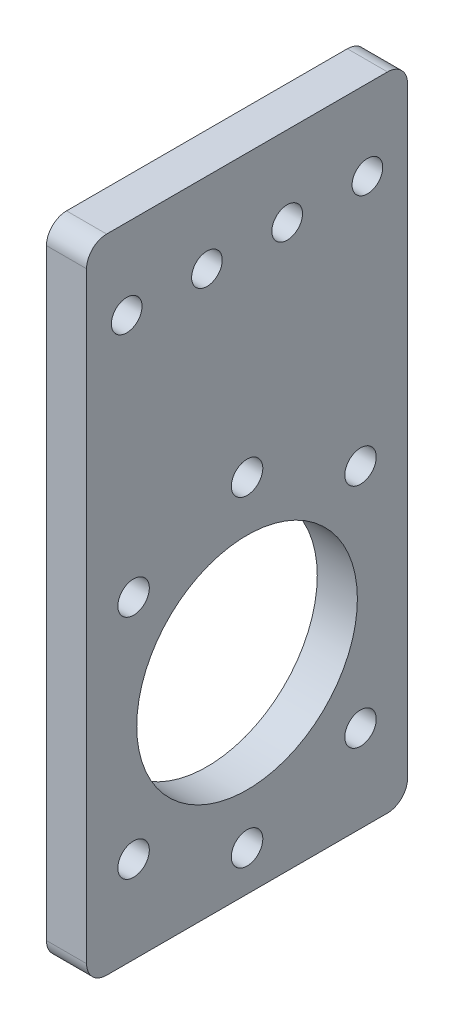
ISO-10303-21;
HEADER;
FILE_DESCRIPTION(('STEP AP214'),'2;1');
FILE_NAME('part.step','',(''),(''),'','','');
FILE_SCHEMA(('AUTOMOTIVE_DESIGN { 1 0 10303 214 1 1 1 1 }'));
ENDSEC;
DATA;
#1=APPLICATION_CONTEXT('core data for automotive mechanical design processes');
#2=APPLICATION_PROTOCOL_DEFINITION('international standard','automotive_design',2000,#1);
#3=PRODUCT_CONTEXT('',#1,'mechanical');
#4=PRODUCT('Part','Part','',(#3));
#5=PRODUCT_RELATED_PRODUCT_CATEGORY('part','',(#4));
#6=PRODUCT_DEFINITION_FORMATION('','',#4);
#7=PRODUCT_DEFINITION_CONTEXT('part definition',#1,'design');
#8=PRODUCT_DEFINITION('design','',#6,#7);
#9=PRODUCT_DEFINITION_SHAPE('','',#8);
#10=(LENGTH_UNIT() NAMED_UNIT(*) SI_UNIT(.MILLI.,.METRE.));
#11=(NAMED_UNIT(*) PLANE_ANGLE_UNIT() SI_UNIT($,.RADIAN.));
#12=(NAMED_UNIT(*) SI_UNIT($,.STERADIAN.) SOLID_ANGLE_UNIT());
#13=UNCERTAINTY_MEASURE_WITH_UNIT(LENGTH_MEASURE(1.E-05),#10,'distance_accuracy_value','');
#14=(GEOMETRIC_REPRESENTATION_CONTEXT(3) GLOBAL_UNCERTAINTY_ASSIGNED_CONTEXT((#13)) GLOBAL_UNIT_ASSIGNED_CONTEXT((#10,
#11,#12)) REPRESENTATION_CONTEXT('',''));
#15=CARTESIAN_POINT('',(0.,0.,0.));
#16=DIRECTION('',(0.,0.,1.));
#17=DIRECTION('',(1.,0.,0.));
#18=AXIS2_PLACEMENT_3D('',#15,#16,#17);
#19=CARTESIAN_POINT('',(-285.75,-85.725,82.55));
#20=DIRECTION('',(0.,0.,1.));
#21=DIRECTION('',(1.,0.,0.));
#22=AXIS2_PLACEMENT_3D('',#19,#20,#21);
#23=PLANE('',#22);
#24=DIRECTION('',(0.,-1.,0.));
#25=VECTOR('',#24,1.);
#26=CARTESIAN_POINT('',(-285.75,-85.725,82.55));
#27=LINE('',#26,#25);
#28=CARTESIAN_POINT('',(-285.75,-3.175,82.55));
#29=VERTEX_POINT('',#28);
#30=CARTESIAN_POINT('',(-285.75,-98.425,82.55));
#31=VERTEX_POINT('',#30);
#32=EDGE_CURVE('E170',#29,#31,#27,.T.);
#33=ORIENTED_EDGE('',*,*,#32,.T.);
#34=DIRECTION('',(1.,0.,0.));
#35=VECTOR('',#34,1.);
#36=CARTESIAN_POINT('',(-279.4,-98.425,82.55));
#37=LINE('',#36,#35);
#38=CARTESIAN_POINT('',(-279.4,-98.425,82.55));
#39=VERTEX_POINT('',#38);
#40=EDGE_CURVE('E154',#31,#39,#37,.T.);
#41=ORIENTED_EDGE('',*,*,#40,.T.);
#42=DIRECTION('',(0.,-1.,0.));
#43=VECTOR('',#42,1.);
#44=CARTESIAN_POINT('',(-279.4,-85.725,82.55));
#45=LINE('',#44,#43);
#46=CARTESIAN_POINT('',(-279.4,-3.175,82.55));
#47=VERTEX_POINT('',#46);
#48=EDGE_CURVE('E109',#47,#39,#45,.T.);
#49=ORIENTED_EDGE('',*,*,#48,.F.);
#50=DIRECTION('',(1.,0.,0.));
#51=VECTOR('',#50,1.);
#52=CARTESIAN_POINT('',(-285.75,-3.175,82.55));
#53=LINE('',#52,#51);
#54=EDGE_CURVE('E152',#47,#29,#53,.F.);
#55=ORIENTED_EDGE('',*,*,#54,.T.);
#56=EDGE_LOOP('',(#33,#41,#49,#55));
#57=FACE_BOUND('',#56,.T.);
#58=ADVANCED_FACE('F17',(#57),#23,.T.);
#59=CARTESIAN_POINT('',(-285.75,0.,622.3));
#60=DIRECTION('',(0.,1.,0.));
#61=DIRECTION('',(0.,0.,1.));
#62=AXIS2_PLACEMENT_3D('',#59,#60,#61);
#63=PLANE('',#62);
#64=DIRECTION('',(0.,0.,1.));
#65=VECTOR('',#64,1.);
#66=CARTESIAN_POINT('',(-279.4,0.,622.3));
#67=LINE('',#66,#65);
#68=CARTESIAN_POINT('',(-279.4,0.,34.925));
#69=VERTEX_POINT('',#68);
#70=CARTESIAN_POINT('',(-279.4,0.,79.375));
#71=VERTEX_POINT('',#70);
#72=EDGE_CURVE('E132',#69,#71,#67,.T.);
#73=ORIENTED_EDGE('',*,*,#72,.F.);
#74=DIRECTION('',(1.,0.,0.));
#75=VECTOR('',#74,1.);
#76=CARTESIAN_POINT('',(-285.75,0.,34.925));
#77=LINE('',#76,#75);
#78=CARTESIAN_POINT('',(-285.75,0.,34.925));
#79=VERTEX_POINT('',#78);
#80=EDGE_CURVE('E11',#69,#79,#77,.F.);
#81=ORIENTED_EDGE('',*,*,#80,.T.);
#82=DIRECTION('',(0.,0.,1.));
#83=VECTOR('',#82,1.);
#84=CARTESIAN_POINT('',(-285.75,0.,622.3));
#85=LINE('',#84,#83);
#86=CARTESIAN_POINT('',(-285.75,0.,79.375));
#87=VERTEX_POINT('',#86);
#88=EDGE_CURVE('E136',#79,#87,#85,.T.);
#89=ORIENTED_EDGE('',*,*,#88,.T.);
#90=DIRECTION('',(1.,0.,0.));
#91=VECTOR('',#90,1.);
#92=CARTESIAN_POINT('',(-285.75,0.,79.375));
#93=LINE('',#92,#91);
#94=EDGE_CURVE('E25',#87,#71,#93,.T.);
#95=ORIENTED_EDGE('',*,*,#94,.T.);
#96=EDGE_LOOP('',(#73,#81,#89,#95));
#97=FACE_BOUND('',#96,.T.);
#98=ADVANCED_FACE('F158',(#97),#63,.T.);
#99=CARTESIAN_POINT('',(-285.75,-85.725,31.75));
#100=DIRECTION('',(0.,0.,1.));
#101=DIRECTION('',(1.,0.,0.));
#102=AXIS2_PLACEMENT_3D('',#99,#100,#101);
#103=PLANE('',#102);
#104=DIRECTION('',(0.,-1.,0.));
#105=VECTOR('',#104,1.);
#106=CARTESIAN_POINT('',(-279.4,-85.725,31.75));
#107=LINE('',#106,#105);
#108=CARTESIAN_POINT('',(-279.4,-3.175,31.75));
#109=VERTEX_POINT('',#108);
#110=CARTESIAN_POINT('',(-279.4,-98.425,31.75));
#111=VERTEX_POINT('',#110);
#112=EDGE_CURVE('E110',#109,#111,#107,.T.);
#113=ORIENTED_EDGE('',*,*,#112,.T.);
#114=DIRECTION('',(1.,0.,0.));
#115=VECTOR('',#114,1.);
#116=CARTESIAN_POINT('',(-285.75,-98.425,31.75));
#117=LINE('',#116,#115);
#118=CARTESIAN_POINT('',(-285.75,-98.425,31.75));
#119=VERTEX_POINT('',#118);
#120=EDGE_CURVE('E87',#111,#119,#117,.F.);
#121=ORIENTED_EDGE('',*,*,#120,.T.);
#122=DIRECTION('',(0.,-1.,0.));
#123=VECTOR('',#122,1.);
#124=CARTESIAN_POINT('',(-285.75,-85.725,31.75));
#125=LINE('',#124,#123);
#126=CARTESIAN_POINT('',(-285.75,-3.175,31.75));
#127=VERTEX_POINT('',#126);
#128=EDGE_CURVE('E135',#127,#119,#125,.T.);
#129=ORIENTED_EDGE('',*,*,#128,.F.);
#130=DIRECTION('',(1.,0.,0.));
#131=VECTOR('',#130,1.);
#132=CARTESIAN_POINT('',(-279.4,-3.175,31.75));
#133=LINE('',#132,#131);
#134=EDGE_CURVE('E92',#127,#109,#133,.T.);
#135=ORIENTED_EDGE('',*,*,#134,.T.);
#136=EDGE_LOOP('',(#113,#121,#129,#135));
#137=FACE_BOUND('',#136,.T.);
#138=ADVANCED_FACE('F167',(#137),#103,.F.);
#139=CARTESIAN_POINT('',(-285.75,-12.7,63.5));
#140=DIRECTION('',(1.,0.,0.));
#141=DIRECTION('',(0.,0.,-1.));
#142=AXIS2_PLACEMENT_3D('',#139,#140,#141);
#143=CYLINDRICAL_SURFACE('',#142,2.4257);
#144=CARTESIAN_POINT('',(-285.75,-12.7,63.5));
#145=DIRECTION('',(-1.,0.,0.));
#146=DIRECTION('',(0.,0.,1.));
#147=AXIS2_PLACEMENT_3D('',#144,#145,#146);
#148=CIRCLE('',#147,2.4257);
#149=CARTESIAN_POINT('',(-285.75,-12.7,65.9257));
#150=VERTEX_POINT('',#149);
#151=EDGE_CURVE('E186',#150,#150,#148,.T.);
#152=ORIENTED_EDGE('',*,*,#151,.T.);
#153=EDGE_LOOP('',(#152));
#154=FACE_BOUND('',#153,.T.);
#155=CARTESIAN_POINT('',(-279.4,-12.7,63.5));
#156=DIRECTION('',(-1.,0.,0.));
#157=DIRECTION('',(0.,0.,1.));
#158=AXIS2_PLACEMENT_3D('',#155,#156,#157);
#159=CIRCLE('',#158,2.4257);
#160=CARTESIAN_POINT('',(-279.4,-12.7,65.9257));
#161=VERTEX_POINT('',#160);
#162=EDGE_CURVE('E126',#161,#161,#159,.T.);
#163=ORIENTED_EDGE('',*,*,#162,.F.);
#164=EDGE_LOOP('',(#163));
#165=FACE_BOUND('',#164,.T.);
#166=ADVANCED_FACE('F227',(#154,#165),#143,.F.);
#167=CARTESIAN_POINT('',(-285.75,-12.7,76.2));
#168=DIRECTION('',(1.,0.,0.));
#169=DIRECTION('',(0.,0.,-1.));
#170=AXIS2_PLACEMENT_3D('',#167,#168,#169);
#171=CYLINDRICAL_SURFACE('',#170,2.4257);
#172=CARTESIAN_POINT('',(-285.75,-12.7,76.2));
#173=DIRECTION('',(-1.,0.,0.));
#174=DIRECTION('',(0.,0.,1.));
#175=AXIS2_PLACEMENT_3D('',#172,#173,#174);
#176=CIRCLE('',#175,2.4257);
#177=CARTESIAN_POINT('',(-285.75,-12.7,78.6257));
#178=VERTEX_POINT('',#177);
#179=EDGE_CURVE('E183',#178,#178,#176,.T.);
#180=ORIENTED_EDGE('',*,*,#179,.T.);
#181=EDGE_LOOP('',(#180));
#182=FACE_BOUND('',#181,.T.);
#183=CARTESIAN_POINT('',(-279.4,-12.7,76.2));
#184=DIRECTION('',(-1.,0.,0.));
#185=DIRECTION('',(0.,0.,1.));
#186=AXIS2_PLACEMENT_3D('',#183,#184,#185);
#187=CIRCLE('',#186,2.4257);
#188=CARTESIAN_POINT('',(-279.4,-12.7,78.6257));
#189=VERTEX_POINT('',#188);
#190=EDGE_CURVE('E123',#189,#189,#187,.T.);
#191=ORIENTED_EDGE('',*,*,#190,.F.);
#192=EDGE_LOOP('',(#191));
#193=FACE_BOUND('',#192,.T.);
#194=ADVANCED_FACE('F254',(#182,#193),#171,.F.);
#195=CARTESIAN_POINT('',(-285.75,-12.7,38.1));
#196=DIRECTION('',(1.,0.,0.));
#197=DIRECTION('',(0.,0.,-1.));
#198=AXIS2_PLACEMENT_3D('',#195,#196,#197);
#199=CYLINDRICAL_SURFACE('',#198,2.4257);
#200=CARTESIAN_POINT('',(-285.75,-12.7,38.1));
#201=DIRECTION('',(-1.,0.,0.));
#202=DIRECTION('',(0.,0.,1.));
#203=AXIS2_PLACEMENT_3D('',#200,#201,#202);
#204=CIRCLE('',#203,2.4257);
#205=CARTESIAN_POINT('',(-285.75,-12.7,40.5257));
#206=VERTEX_POINT('',#205);
#207=EDGE_CURVE('E180',#206,#206,#204,.T.);
#208=ORIENTED_EDGE('',*,*,#207,.T.);
#209=EDGE_LOOP('',(#208));
#210=FACE_BOUND('',#209,.T.);
#211=CARTESIAN_POINT('',(-279.4,-12.7,38.1));
#212=DIRECTION('',(-1.,0.,0.));
#213=DIRECTION('',(0.,0.,1.));
#214=AXIS2_PLACEMENT_3D('',#211,#212,#213);
#215=CIRCLE('',#214,2.4257);
#216=CARTESIAN_POINT('',(-279.4,-12.7,40.5257));
#217=VERTEX_POINT('',#216);
#218=EDGE_CURVE('E120',#217,#217,#215,.T.);
#219=ORIENTED_EDGE('',*,*,#218,.F.);
#220=EDGE_LOOP('',(#219));
#221=FACE_BOUND('',#220,.T.);
#222=ADVANCED_FACE('F263',(#210,#221),#199,.F.);
#223=CARTESIAN_POINT('',(-285.75,-69.85,57.15));
#224=DIRECTION('',(1.,0.,0.));
#225=DIRECTION('',(0.,0.,-1.));
#226=AXIS2_PLACEMENT_3D('',#223,#224,#225);
#227=CYLINDRICAL_SURFACE('',#226,17.4625);
#228=CARTESIAN_POINT('',(-285.75,-69.85,57.15));
#229=DIRECTION('',(-1.,0.,0.));
#230=DIRECTION('',(0.,0.,1.));
#231=AXIS2_PLACEMENT_3D('',#228,#229,#230);
#232=CIRCLE('',#231,17.4625);
#233=CARTESIAN_POINT('',(-285.75,-69.85,74.6125));
#234=VERTEX_POINT('',#233);
#235=EDGE_CURVE('E177',#234,#234,#232,.T.);
#236=ORIENTED_EDGE('',*,*,#235,.T.);
#237=EDGE_LOOP('',(#236));
#238=FACE_BOUND('',#237,.T.);
#239=CARTESIAN_POINT('',(-279.4,-69.85,57.15));
#240=DIRECTION('',(-1.,0.,0.));
#241=DIRECTION('',(0.,0.,1.));
#242=AXIS2_PLACEMENT_3D('',#239,#240,#241);
#243=CIRCLE('',#242,17.4625);
#244=CARTESIAN_POINT('',(-279.4,-69.85,74.6125));
#245=VERTEX_POINT('',#244);
#246=EDGE_CURVE('E112',#245,#245,#243,.T.);
#247=ORIENTED_EDGE('',*,*,#246,.F.);
#248=EDGE_LOOP('',(#247));
#249=FACE_BOUND('',#248,.T.);
#250=ADVANCED_FACE('F221',(#238,#249),#227,.F.);
#251=CARTESIAN_POINT('',(-285.75,-101.6,57.15));
#252=DIRECTION('',(0.,1.,0.));
#253=DIRECTION('',(0.,0.,1.));
#254=AXIS2_PLACEMENT_3D('',#251,#252,#253);
#255=PLANE('',#254);
#256=DIRECTION('',(0.,0.,1.));
#257=VECTOR('',#256,1.);
#258=CARTESIAN_POINT('',(-285.75,-101.6,57.15));
#259=LINE('',#258,#257);
#260=CARTESIAN_POINT('',(-285.75,-101.6,34.925));
#261=VERTEX_POINT('',#260);
#262=CARTESIAN_POINT('',(-285.75,-101.6,79.375));
#263=VERTEX_POINT('',#262);
#264=EDGE_CURVE('E102',#261,#263,#259,.T.);
#265=ORIENTED_EDGE('',*,*,#264,.F.);
#266=DIRECTION('',(1.,0.,0.));
#267=VECTOR('',#266,1.);
#268=CARTESIAN_POINT('',(-285.75,-101.6,34.925));
#269=LINE('',#268,#267);
#270=CARTESIAN_POINT('',(-279.4,-101.6,34.925));
#271=VERTEX_POINT('',#270);
#272=EDGE_CURVE('E86',#261,#271,#269,.T.);
#273=ORIENTED_EDGE('',*,*,#272,.T.);
#274=DIRECTION('',(0.,0.,1.));
#275=VECTOR('',#274,1.);
#276=CARTESIAN_POINT('',(-279.4,-101.6,57.15));
#277=LINE('',#276,#275);
#278=CARTESIAN_POINT('',(-279.4,-101.6,79.375));
#279=VERTEX_POINT('',#278);
#280=EDGE_CURVE('E99',#271,#279,#277,.T.);
#281=ORIENTED_EDGE('',*,*,#280,.T.);
#282=DIRECTION('',(1.,0.,0.));
#283=VECTOR('',#282,1.);
#284=CARTESIAN_POINT('',(-285.75,-101.6,79.375));
#285=LINE('',#284,#283);
#286=EDGE_CURVE('E104',#279,#263,#285,.F.);
#287=ORIENTED_EDGE('',*,*,#286,.T.);
#288=EDGE_LOOP('',(#265,#273,#281,#287));
#289=FACE_BOUND('',#288,.T.);
#290=ADVANCED_FACE('F98',(#289),#255,.F.);
#291=CARTESIAN_POINT('',(-285.75,-12.7,50.8));
#292=DIRECTION('',(1.,0.,0.));
#293=DIRECTION('',(0.,0.,-1.));
#294=AXIS2_PLACEMENT_3D('',#291,#292,#293);
#295=CYLINDRICAL_SURFACE('',#294,2.4257);
#296=CARTESIAN_POINT('',(-285.75,-12.7,50.8));
#297=DIRECTION('',(-1.,0.,0.));
#298=DIRECTION('',(0.,0.,1.));
#299=AXIS2_PLACEMENT_3D('',#296,#297,#298);
#300=CIRCLE('',#299,2.4257);
#301=CARTESIAN_POINT('',(-285.75,-12.7,53.2257));
#302=VERTEX_POINT('',#301);
#303=EDGE_CURVE('E189',#302,#302,#300,.T.);
#304=ORIENTED_EDGE('',*,*,#303,.T.);
#305=EDGE_LOOP('',(#304));
#306=FACE_BOUND('',#305,.T.);
#307=CARTESIAN_POINT('',(-279.4,-12.7,50.8));
#308=DIRECTION('',(-1.,0.,0.));
#309=DIRECTION('',(0.,0.,1.));
#310=AXIS2_PLACEMENT_3D('',#307,#308,#309);
#311=CIRCLE('',#310,2.4257);
#312=CARTESIAN_POINT('',(-279.4,-12.7,53.2257));
#313=VERTEX_POINT('',#312);
#314=EDGE_CURVE('E129',#313,#313,#311,.T.);
#315=ORIENTED_EDGE('',*,*,#314,.F.);
#316=EDGE_LOOP('',(#315));
#317=FACE_BOUND('',#316,.T.);
#318=ADVANCED_FACE('F193',(#306,#317),#295,.F.);
#319=CARTESIAN_POINT('',(-285.75,-50.8,622.3));
#320=DIRECTION('',(-1.,0.,0.));
#321=DIRECTION('',(0.,-1.,0.));
#322=AXIS2_PLACEMENT_3D('',#319,#320,#321);
#323=PLANE('',#322);
#324=CARTESIAN_POINT('',(-285.75,-87.8105122421383,75.1105122421384));
#325=DIRECTION('',(-1.,0.,0.));
#326=DIRECTION('',(0.,0.,1.));
#327=AXIS2_PLACEMENT_3D('',#324,#325,#326);
#328=CIRCLE('',#327,2.4892);
#329=CARTESIAN_POINT('',(-285.75,-87.8105122421383,77.5997122421384));
#330=VERTEX_POINT('',#329);
#331=EDGE_CURVE('E114',#330,#330,#328,.F.);
#332=ORIENTED_EDGE('',*,*,#331,.T.);
#333=EDGE_LOOP('',(#332));
#334=FACE_BOUND('',#333,.T.);
#335=CARTESIAN_POINT('',(-285.75,-95.25,57.15));
#336=DIRECTION('',(-1.,0.,0.));
#337=DIRECTION('',(0.,0.,1.));
#338=AXIS2_PLACEMENT_3D('',#335,#336,#337);
#339=CIRCLE('',#338,2.4892);
#340=CARTESIAN_POINT('',(-285.75,-95.25,59.6392));
#341=VERTEX_POINT('',#340);
#342=EDGE_CURVE('E393',#341,#341,#339,.F.);
#343=ORIENTED_EDGE('',*,*,#342,.T.);
#344=EDGE_LOOP('',(#343));
#345=FACE_BOUND('',#344,.T.);
#346=CARTESIAN_POINT('',(-285.75,-87.8105122421383,39.1894877578618));
#347=DIRECTION('',(-1.,0.,0.));
#348=DIRECTION('',(0.,0.,1.));
#349=AXIS2_PLACEMENT_3D('',#346,#347,#348);
#350=CIRCLE('',#349,2.4892);
#351=CARTESIAN_POINT('',(-285.75,-87.8105122421383,41.6786877578618));
#352=VERTEX_POINT('',#351);
#353=EDGE_CURVE('E391',#352,#352,#350,.F.);
#354=ORIENTED_EDGE('',*,*,#353,.T.);
#355=EDGE_LOOP('',(#354));
#356=FACE_BOUND('',#355,.T.);
#357=CARTESIAN_POINT('',(-285.75,-44.45,57.15));
#358=DIRECTION('',(-1.,0.,0.));
#359=DIRECTION('',(0.,0.,1.));
#360=AXIS2_PLACEMENT_3D('',#357,#358,#359);
#361=CIRCLE('',#360,2.4892);
#362=CARTESIAN_POINT('',(-285.75,-44.45,59.6392));
#363=VERTEX_POINT('',#362);
#364=EDGE_CURVE('E388',#363,#363,#361,.F.);
#365=ORIENTED_EDGE('',*,*,#364,.T.);
#366=EDGE_LOOP('',(#365));
#367=FACE_BOUND('',#366,.T.);
#368=CARTESIAN_POINT('',(-285.75,-51.8894877578617,39.1894877578618));
#369=DIRECTION('',(-1.,0.,0.));
#370=DIRECTION('',(0.,0.,1.));
#371=AXIS2_PLACEMENT_3D('',#368,#369,#370);
#372=CIRCLE('',#371,2.4892);
#373=CARTESIAN_POINT('',(-285.75,-51.8894877578617,41.6786877578618));
#374=VERTEX_POINT('',#373);
#375=EDGE_CURVE('E385',#374,#374,#372,.F.);
#376=ORIENTED_EDGE('',*,*,#375,.T.);
#377=EDGE_LOOP('',(#376));
#378=FACE_BOUND('',#377,.T.);
#379=CARTESIAN_POINT('',(-285.75,-51.8894877578617,75.1105122421384));
#380=DIRECTION('',(-1.,0.,0.));
#381=DIRECTION('',(0.,0.,1.));
#382=AXIS2_PLACEMENT_3D('',#379,#380,#381);
#383=CIRCLE('',#382,2.4892);
#384=CARTESIAN_POINT('',(-285.75,-51.8894877578617,77.5997122421384));
#385=VERTEX_POINT('',#384);
#386=EDGE_CURVE('E382',#385,#385,#383,.F.);
#387=ORIENTED_EDGE('',*,*,#386,.T.);
#388=EDGE_LOOP('',(#387));
#389=FACE_BOUND('',#388,.T.);
#390=ORIENTED_EDGE('',*,*,#128,.T.);
#391=CARTESIAN_POINT('',(-285.75,-98.425,34.925));
#392=DIRECTION('',(-1.,0.,0.));
#393=DIRECTION('',(0.,0.,1.));
#394=AXIS2_PLACEMENT_3D('',#391,#392,#393);
#395=CIRCLE('',#394,3.175);
#396=EDGE_CURVE('E150',#119,#261,#395,.T.);
#397=ORIENTED_EDGE('',*,*,#396,.T.);
#398=ORIENTED_EDGE('',*,*,#264,.T.);
#399=CARTESIAN_POINT('',(-285.75,-98.425,79.375));
#400=DIRECTION('',(-1.,0.,0.));
#401=DIRECTION('',(0.,0.,1.));
#402=AXIS2_PLACEMENT_3D('',#399,#400,#401);
#403=CIRCLE('',#402,3.175);
#404=EDGE_CURVE('E148',#263,#31,#403,.T.);
#405=ORIENTED_EDGE('',*,*,#404,.T.);
#406=ORIENTED_EDGE('',*,*,#32,.F.);
#407=CARTESIAN_POINT('',(-285.75,-3.175,79.375));
#408=DIRECTION('',(-1.,0.,0.));
#409=DIRECTION('',(0.,0.,1.));
#410=AXIS2_PLACEMENT_3D('',#407,#408,#409);
#411=CIRCLE('',#410,3.175);
#412=EDGE_CURVE('E32',#29,#87,#411,.T.);
#413=ORIENTED_EDGE('',*,*,#412,.T.);
#414=ORIENTED_EDGE('',*,*,#88,.F.);
#415=CARTESIAN_POINT('',(-285.75,-3.175,34.925));
#416=DIRECTION('',(-1.,0.,0.));
#417=DIRECTION('',(0.,0.,1.));
#418=AXIS2_PLACEMENT_3D('',#415,#416,#417);
#419=CIRCLE('',#418,3.175);
#420=EDGE_CURVE('E146',#79,#127,#419,.T.);
#421=ORIENTED_EDGE('',*,*,#420,.T.);
#422=EDGE_LOOP('',(#390,#397,#398,#405,#406,#413,#414,#421));
#423=FACE_BOUND('',#422,.T.);
#424=ORIENTED_EDGE('',*,*,#235,.F.);
#425=EDGE_LOOP('',(#424));
#426=FACE_BOUND('',#425,.T.);
#427=ORIENTED_EDGE('',*,*,#207,.F.);
#428=EDGE_LOOP('',(#427));
#429=FACE_BOUND('',#428,.T.);
#430=ORIENTED_EDGE('',*,*,#179,.F.);
#431=EDGE_LOOP('',(#430));
#432=FACE_BOUND('',#431,.T.);
#433=ORIENTED_EDGE('',*,*,#151,.F.);
#434=EDGE_LOOP('',(#433));
#435=FACE_BOUND('',#434,.T.);
#436=ORIENTED_EDGE('',*,*,#303,.F.);
#437=EDGE_LOOP('',(#436));
#438=FACE_BOUND('',#437,.T.);
#439=ADVANCED_FACE('F196',(#334,#345,#356,#367,#378,#389,#423,#426,#429,#432,#435,#438),#323,.T.);
#440=CARTESIAN_POINT('',(-279.4,-50.8,622.3));
#441=DIRECTION('',(-1.,0.,0.));
#442=DIRECTION('',(0.,-1.,0.));
#443=AXIS2_PLACEMENT_3D('',#440,#441,#442);
#444=PLANE('',#443);
#445=CARTESIAN_POINT('',(-279.4,-87.8105122421383,75.1105122421384));
#446=DIRECTION('',(-1.,0.,0.));
#447=DIRECTION('',(0.,0.,1.));
#448=AXIS2_PLACEMENT_3D('',#445,#446,#447);
#449=CIRCLE('',#448,2.4892);
#450=CARTESIAN_POINT('',(-279.4,-87.8105122421383,77.5997122421384));
#451=VERTEX_POINT('',#450);
#452=EDGE_CURVE('E364',#451,#451,#449,.T.);
#453=ORIENTED_EDGE('',*,*,#452,.T.);
#454=EDGE_LOOP('',(#453));
#455=FACE_BOUND('',#454,.T.);
#456=CARTESIAN_POINT('',(-279.4,-95.25,57.15));
#457=DIRECTION('',(-1.,0.,0.));
#458=DIRECTION('',(0.,0.,1.));
#459=AXIS2_PLACEMENT_3D('',#456,#457,#458);
#460=CIRCLE('',#459,2.4892);
#461=CARTESIAN_POINT('',(-279.4,-95.25,59.6392));
#462=VERTEX_POINT('',#461);
#463=EDGE_CURVE('E365',#462,#462,#460,.T.);
#464=ORIENTED_EDGE('',*,*,#463,.T.);
#465=EDGE_LOOP('',(#464));
#466=FACE_BOUND('',#465,.T.);
#467=CARTESIAN_POINT('',(-279.4,-87.8105122421383,39.1894877578618));
#468=DIRECTION('',(-1.,0.,0.));
#469=DIRECTION('',(0.,0.,1.));
#470=AXIS2_PLACEMENT_3D('',#467,#468,#469);
#471=CIRCLE('',#470,2.4892);
#472=CARTESIAN_POINT('',(-279.4,-87.8105122421383,41.6786877578618));
#473=VERTEX_POINT('',#472);
#474=EDGE_CURVE('E369',#473,#473,#471,.T.);
#475=ORIENTED_EDGE('',*,*,#474,.T.);
#476=EDGE_LOOP('',(#475));
#477=FACE_BOUND('',#476,.T.);
#478=CARTESIAN_POINT('',(-279.4,-44.45,57.15));
#479=DIRECTION('',(-1.,0.,0.));
#480=DIRECTION('',(0.,0.,1.));
#481=AXIS2_PLACEMENT_3D('',#478,#479,#480);
#482=CIRCLE('',#481,2.4892);
#483=CARTESIAN_POINT('',(-279.4,-44.45,59.6392));
#484=VERTEX_POINT('',#483);
#485=EDGE_CURVE('E374',#484,#484,#482,.T.);
#486=ORIENTED_EDGE('',*,*,#485,.T.);
#487=EDGE_LOOP('',(#486));
#488=FACE_BOUND('',#487,.T.);
#489=CARTESIAN_POINT('',(-279.4,-51.8894877578617,39.1894877578618));
#490=DIRECTION('',(-1.,0.,0.));
#491=DIRECTION('',(0.,0.,1.));
#492=AXIS2_PLACEMENT_3D('',#489,#490,#491);
#493=CIRCLE('',#492,2.4892);
#494=CARTESIAN_POINT('',(-279.4,-51.8894877578617,41.6786877578618));
#495=VERTEX_POINT('',#494);
#496=EDGE_CURVE('E366',#495,#495,#493,.T.);
#497=ORIENTED_EDGE('',*,*,#496,.T.);
#498=EDGE_LOOP('',(#497));
#499=FACE_BOUND('',#498,.T.);
#500=CARTESIAN_POINT('',(-279.4,-51.8894877578617,75.1105122421384));
#501=DIRECTION('',(-1.,0.,0.));
#502=DIRECTION('',(0.,0.,1.));
#503=AXIS2_PLACEMENT_3D('',#500,#501,#502);
#504=CIRCLE('',#503,2.4892);
#505=CARTESIAN_POINT('',(-279.4,-51.8894877578617,77.5997122421384));
#506=VERTEX_POINT('',#505);
#507=EDGE_CURVE('E377',#506,#506,#504,.T.);
#508=ORIENTED_EDGE('',*,*,#507,.T.);
#509=EDGE_LOOP('',(#508));
#510=FACE_BOUND('',#509,.T.);
#511=ORIENTED_EDGE('',*,*,#280,.F.);
#512=CARTESIAN_POINT('',(-279.4,-98.425,34.925));
#513=DIRECTION('',(-1.,0.,0.));
#514=DIRECTION('',(0.,0.,1.));
#515=AXIS2_PLACEMENT_3D('',#512,#513,#514);
#516=CIRCLE('',#515,3.175);
#517=EDGE_CURVE('E82',#271,#111,#516,.F.);
#518=ORIENTED_EDGE('',*,*,#517,.T.);
#519=ORIENTED_EDGE('',*,*,#112,.F.);
#520=CARTESIAN_POINT('',(-279.4,-3.175,34.925));
#521=DIRECTION('',(-1.,0.,0.));
#522=DIRECTION('',(0.,0.,1.));
#523=AXIS2_PLACEMENT_3D('',#520,#521,#522);
#524=CIRCLE('',#523,3.175);
#525=EDGE_CURVE('E139',#109,#69,#524,.F.);
#526=ORIENTED_EDGE('',*,*,#525,.T.);
#527=ORIENTED_EDGE('',*,*,#72,.T.);
#528=CARTESIAN_POINT('',(-279.4,-3.175,79.375));
#529=DIRECTION('',(-1.,0.,0.));
#530=DIRECTION('',(0.,0.,1.));
#531=AXIS2_PLACEMENT_3D('',#528,#529,#530);
#532=CIRCLE('',#531,3.175);
#533=EDGE_CURVE('E103',#71,#47,#532,.F.);
#534=ORIENTED_EDGE('',*,*,#533,.T.);
#535=ORIENTED_EDGE('',*,*,#48,.T.);
#536=CARTESIAN_POINT('',(-279.4,-98.425,79.375));
#537=DIRECTION('',(-1.,0.,0.));
#538=DIRECTION('',(0.,0.,1.));
#539=AXIS2_PLACEMENT_3D('',#536,#537,#538);
#540=CIRCLE('',#539,3.175);
#541=EDGE_CURVE('E93',#39,#279,#540,.F.);
#542=ORIENTED_EDGE('',*,*,#541,.T.);
#543=EDGE_LOOP('',(#511,#518,#519,#526,#527,#534,#535,#542));
#544=FACE_BOUND('',#543,.T.);
#545=ORIENTED_EDGE('',*,*,#246,.T.);
#546=EDGE_LOOP('',(#545));
#547=FACE_BOUND('',#546,.T.);
#548=ORIENTED_EDGE('',*,*,#218,.T.);
#549=EDGE_LOOP('',(#548));
#550=FACE_BOUND('',#549,.T.);
#551=ORIENTED_EDGE('',*,*,#190,.T.);
#552=EDGE_LOOP('',(#551));
#553=FACE_BOUND('',#552,.T.);
#554=ORIENTED_EDGE('',*,*,#162,.T.);
#555=EDGE_LOOP('',(#554));
#556=FACE_BOUND('',#555,.T.);
#557=ORIENTED_EDGE('',*,*,#314,.T.);
#558=EDGE_LOOP('',(#557));
#559=FACE_BOUND('',#558,.T.);
#560=ADVANCED_FACE('F106',(#455,#466,#477,#488,#499,#510,#544,#547,#550,#553,#556,#559),#444,.F.);
#561=CARTESIAN_POINT('',(-279.4,-51.8894877578617,75.1105122421384));
#562=DIRECTION('',(-1.,0.,0.));
#563=DIRECTION('',(0.,0.,1.));
#564=AXIS2_PLACEMENT_3D('',#561,#562,#563);
#565=CYLINDRICAL_SURFACE('',#564,2.4892);
#566=ORIENTED_EDGE('',*,*,#386,.F.);
#567=EDGE_LOOP('',(#566));
#568=FACE_BOUND('',#567,.T.);
#569=ORIENTED_EDGE('',*,*,#507,.F.);
#570=EDGE_LOOP('',(#569));
#571=FACE_BOUND('',#570,.T.);
#572=ADVANCED_FACE('F205',(#568,#571),#565,.F.);
#573=CARTESIAN_POINT('',(-279.4,-51.8894877578617,39.1894877578618));
#574=DIRECTION('',(-1.,0.,0.));
#575=DIRECTION('',(0.,0.,1.));
#576=AXIS2_PLACEMENT_3D('',#573,#574,#575);
#577=CYLINDRICAL_SURFACE('',#576,2.4892);
#578=ORIENTED_EDGE('',*,*,#375,.F.);
#579=EDGE_LOOP('',(#578));
#580=FACE_BOUND('',#579,.T.);
#581=ORIENTED_EDGE('',*,*,#496,.F.);
#582=EDGE_LOOP('',(#581));
#583=FACE_BOUND('',#582,.T.);
#584=ADVANCED_FACE('F308',(#580,#583),#577,.F.);
#585=CARTESIAN_POINT('',(-279.4,-44.45,57.15));
#586=DIRECTION('',(-1.,0.,0.));
#587=DIRECTION('',(0.,0.,1.));
#588=AXIS2_PLACEMENT_3D('',#585,#586,#587);
#589=CYLINDRICAL_SURFACE('',#588,2.4892);
#590=ORIENTED_EDGE('',*,*,#364,.F.);
#591=EDGE_LOOP('',(#590));
#592=FACE_BOUND('',#591,.T.);
#593=ORIENTED_EDGE('',*,*,#485,.F.);
#594=EDGE_LOOP('',(#593));
#595=FACE_BOUND('',#594,.T.);
#596=ADVANCED_FACE('F315',(#592,#595),#589,.F.);
#597=CARTESIAN_POINT('',(-279.4,-87.8105122421383,39.1894877578618));
#598=DIRECTION('',(-1.,0.,0.));
#599=DIRECTION('',(0.,0.,1.));
#600=AXIS2_PLACEMENT_3D('',#597,#598,#599);
#601=CYLINDRICAL_SURFACE('',#600,2.4892);
#602=ORIENTED_EDGE('',*,*,#353,.F.);
#603=EDGE_LOOP('',(#602));
#604=FACE_BOUND('',#603,.T.);
#605=ORIENTED_EDGE('',*,*,#474,.F.);
#606=EDGE_LOOP('',(#605));
#607=FACE_BOUND('',#606,.T.);
#608=ADVANCED_FACE('F323',(#604,#607),#601,.F.);
#609=CARTESIAN_POINT('',(-279.4,-95.25,57.15));
#610=DIRECTION('',(-1.,0.,0.));
#611=DIRECTION('',(0.,0.,1.));
#612=AXIS2_PLACEMENT_3D('',#609,#610,#611);
#613=CYLINDRICAL_SURFACE('',#612,2.4892);
#614=ORIENTED_EDGE('',*,*,#342,.F.);
#615=EDGE_LOOP('',(#614));
#616=FACE_BOUND('',#615,.T.);
#617=ORIENTED_EDGE('',*,*,#463,.F.);
#618=EDGE_LOOP('',(#617));
#619=FACE_BOUND('',#618,.T.);
#620=ADVANCED_FACE('F331',(#616,#619),#613,.F.);
#621=CARTESIAN_POINT('',(-279.4,-87.8105122421383,75.1105122421384));
#622=DIRECTION('',(-1.,0.,0.));
#623=DIRECTION('',(0.,0.,1.));
#624=AXIS2_PLACEMENT_3D('',#621,#622,#623);
#625=CYLINDRICAL_SURFACE('',#624,2.4892);
#626=ORIENTED_EDGE('',*,*,#331,.F.);
#627=EDGE_LOOP('',(#626));
#628=FACE_BOUND('',#627,.T.);
#629=ORIENTED_EDGE('',*,*,#452,.F.);
#630=EDGE_LOOP('',(#629));
#631=FACE_BOUND('',#630,.T.);
#632=ADVANCED_FACE('F231',(#628,#631),#625,.F.);
#633=CARTESIAN_POINT('',(-285.75,-98.425,34.925));
#634=DIRECTION('',(1.,0.,0.));
#635=DIRECTION('',(0.,0.,-1.));
#636=AXIS2_PLACEMENT_3D('',#633,#634,#635);
#637=CYLINDRICAL_SURFACE('',#636,3.175);
#638=ORIENTED_EDGE('',*,*,#396,.F.);
#639=ORIENTED_EDGE('',*,*,#120,.F.);
#640=ORIENTED_EDGE('',*,*,#517,.F.);
#641=ORIENTED_EDGE('',*,*,#272,.F.);
#642=EDGE_LOOP('',(#638,#639,#640,#641));
#643=FACE_BOUND('',#642,.T.);
#644=ADVANCED_FACE('F85',(#643),#637,.T.);
#645=CARTESIAN_POINT('',(-285.75,-98.425,79.375));
#646=DIRECTION('',(-1.,0.,0.));
#647=DIRECTION('',(0.,0.,1.));
#648=AXIS2_PLACEMENT_3D('',#645,#646,#647);
#649=CYLINDRICAL_SURFACE('',#648,3.175);
#650=ORIENTED_EDGE('',*,*,#404,.F.);
#651=ORIENTED_EDGE('',*,*,#286,.F.);
#652=ORIENTED_EDGE('',*,*,#541,.F.);
#653=ORIENTED_EDGE('',*,*,#40,.F.);
#654=EDGE_LOOP('',(#650,#651,#652,#653));
#655=FACE_BOUND('',#654,.T.);
#656=ADVANCED_FACE('F230',(#655),#649,.T.);
#657=CARTESIAN_POINT('',(-285.75,-3.175,34.925));
#658=DIRECTION('',(-1.,0.,0.));
#659=DIRECTION('',(0.,0.,1.));
#660=AXIS2_PLACEMENT_3D('',#657,#658,#659);
#661=CYLINDRICAL_SURFACE('',#660,3.175);
#662=ORIENTED_EDGE('',*,*,#420,.F.);
#663=ORIENTED_EDGE('',*,*,#80,.F.);
#664=ORIENTED_EDGE('',*,*,#525,.F.);
#665=ORIENTED_EDGE('',*,*,#134,.F.);
#666=EDGE_LOOP('',(#662,#663,#664,#665));
#667=FACE_BOUND('',#666,.T.);
#668=ADVANCED_FACE('F164',(#667),#661,.T.);
#669=CARTESIAN_POINT('',(-285.75,-3.175,79.375));
#670=DIRECTION('',(1.,0.,0.));
#671=DIRECTION('',(0.,0.,-1.));
#672=AXIS2_PLACEMENT_3D('',#669,#670,#671);
#673=CYLINDRICAL_SURFACE('',#672,3.175);
#674=ORIENTED_EDGE('',*,*,#412,.F.);
#675=ORIENTED_EDGE('',*,*,#54,.F.);
#676=ORIENTED_EDGE('',*,*,#533,.F.);
#677=ORIENTED_EDGE('',*,*,#94,.F.);
#678=EDGE_LOOP('',(#674,#675,#676,#677));
#679=FACE_BOUND('',#678,.T.);
#680=ADVANCED_FACE('F19',(#679),#673,.T.);
#681=CLOSED_SHELL('',(#58,#98,#138,#166,#194,#222,#250,#290,#318,#439,#560,#572,#584,#596,#608,
#620,#632,#644,#656,#668,#680));
#682=MANIFOLD_SOLID_BREP('B1',#681);
#683=ADVANCED_BREP_SHAPE_REPRESENTATION('',(#18,#682),#14);
#684=SHAPE_DEFINITION_REPRESENTATION(#9,#683);
ENDSEC;
END-ISO-10303-21;
